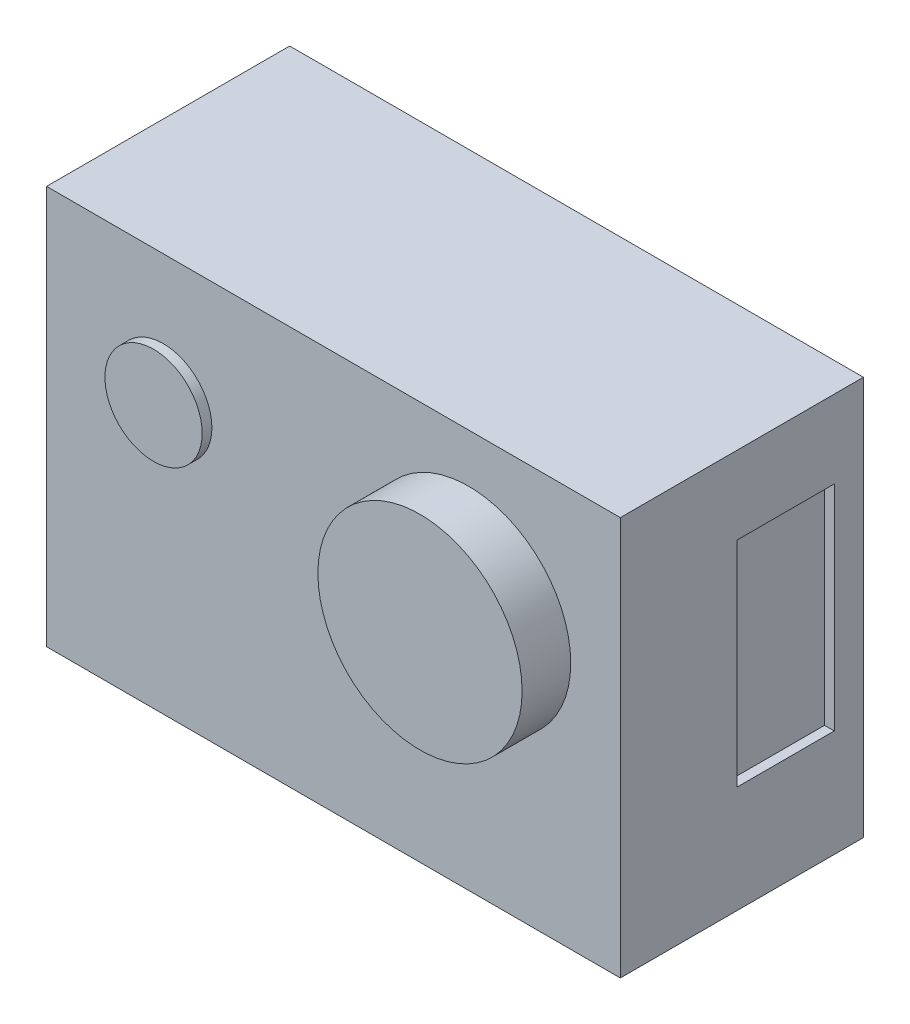
ISO-10303-21;
HEADER;
FILE_DESCRIPTION(('STEP AP214'),'2;1');
FILE_NAME('part.step','',(''),(''),'','','');
FILE_SCHEMA(('AUTOMOTIVE_DESIGN { 1 0 10303 214 1 1 1 1 }'));
ENDSEC;
DATA;
#1=APPLICATION_CONTEXT('core data for automotive mechanical design processes');
#2=APPLICATION_PROTOCOL_DEFINITION('international standard','automotive_design',2000,#1);
#3=PRODUCT_CONTEXT('',#1,'mechanical');
#4=PRODUCT('Part','Part','',(#3));
#5=PRODUCT_RELATED_PRODUCT_CATEGORY('part','',(#4));
#6=PRODUCT_DEFINITION_FORMATION('','',#4);
#7=PRODUCT_DEFINITION_CONTEXT('part definition',#1,'design');
#8=PRODUCT_DEFINITION('design','',#6,#7);
#9=PRODUCT_DEFINITION_SHAPE('','',#8);
#10=(LENGTH_UNIT() NAMED_UNIT(*) SI_UNIT(.MILLI.,.METRE.));
#11=(NAMED_UNIT(*) PLANE_ANGLE_UNIT() SI_UNIT($,.RADIAN.));
#12=(NAMED_UNIT(*) SI_UNIT($,.STERADIAN.) SOLID_ANGLE_UNIT());
#13=UNCERTAINTY_MEASURE_WITH_UNIT(LENGTH_MEASURE(1.E-05),#10,'distance_accuracy_value','');
#14=(GEOMETRIC_REPRESENTATION_CONTEXT(3) GLOBAL_UNCERTAINTY_ASSIGNED_CONTEXT((#13)) GLOBAL_UNIT_ASSIGNED_CONTEXT((#10,
#11,#12)) REPRESENTATION_CONTEXT('',''));
#15=CARTESIAN_POINT('',(0.,0.,0.));
#16=DIRECTION('',(0.,0.,1.));
#17=DIRECTION('',(1.,0.,0.));
#18=AXIS2_PLACEMENT_3D('',#15,#16,#17);
#19=CARTESIAN_POINT('',(-29.5,20.4999999999999,25.));
#20=DIRECTION('',(1.,0.,0.));
#21=DIRECTION('',(0.,1.,0.));
#22=AXIS2_PLACEMENT_3D('',#19,#20,#21);
#23=PLANE('',#22);
#24=DIRECTION('',(0.,-1.,0.));
#25=VECTOR('',#24,1.);
#26=CARTESIAN_POINT('',(-29.5,20.4999999999999,0.));
#27=LINE('',#26,#25);
#28=CARTESIAN_POINT('',(-29.5,20.4999999999999,0.));
#29=VERTEX_POINT('',#28);
#30=CARTESIAN_POINT('',(-29.5,-20.5,0.));
#31=VERTEX_POINT('',#30);
#32=EDGE_CURVE('E164',#29,#31,#27,.T.);
#33=ORIENTED_EDGE('',*,*,#32,.T.);
#34=DIRECTION('',(0.,0.,-1.));
#35=VECTOR('',#34,1.);
#36=CARTESIAN_POINT('',(-29.5,-20.5,25.));
#37=LINE('',#36,#35);
#38=CARTESIAN_POINT('',(-29.5,-20.5,25.));
#39=VERTEX_POINT('',#38);
#40=EDGE_CURVE('E48',#39,#31,#37,.T.);
#41=ORIENTED_EDGE('',*,*,#40,.F.);
#42=DIRECTION('',(0.,-1.,0.));
#43=VECTOR('',#42,1.);
#44=CARTESIAN_POINT('',(-29.5,20.4999999999999,25.));
#45=LINE('',#44,#43);
#46=CARTESIAN_POINT('',(-29.5,20.4999999999999,25.));
#47=VERTEX_POINT('',#46);
#48=EDGE_CURVE('E166',#47,#39,#45,.T.);
#49=ORIENTED_EDGE('',*,*,#48,.F.);
#50=DIRECTION('',(0.,0.,-1.));
#51=VECTOR('',#50,1.);
#52=CARTESIAN_POINT('',(-29.5,20.4999999999999,25.));
#53=LINE('',#52,#51);
#54=EDGE_CURVE('E69',#47,#29,#53,.T.);
#55=ORIENTED_EDGE('',*,*,#54,.T.);
#56=EDGE_LOOP('',(#33,#41,#49,#55));
#57=FACE_BOUND('',#56,.T.);
#58=ADVANCED_FACE('F45',(#57),#23,.F.);
#59=CARTESIAN_POINT('',(-29.5,-20.5,25.));
#60=DIRECTION('',(0.,1.,0.));
#61=DIRECTION('',(0.,0.,1.));
#62=AXIS2_PLACEMENT_3D('',#59,#60,#61);
#63=PLANE('',#62);
#64=DIRECTION('',(1.,0.,0.));
#65=VECTOR('',#64,1.);
#66=CARTESIAN_POINT('',(-29.5,-20.5,0.));
#67=LINE('',#66,#65);
#68=CARTESIAN_POINT('',(29.5,-20.5,0.));
#69=VERTEX_POINT('',#68);
#70=EDGE_CURVE('E176',#31,#69,#67,.T.);
#71=ORIENTED_EDGE('',*,*,#70,.T.);
#72=DIRECTION('',(0.,0.,-1.));
#73=VECTOR('',#72,1.);
#74=CARTESIAN_POINT('',(29.5,-20.5,25.));
#75=LINE('',#74,#73);
#76=CARTESIAN_POINT('',(29.5,-20.5,25.));
#77=VERTEX_POINT('',#76);
#78=EDGE_CURVE('E186',#77,#69,#75,.T.);
#79=ORIENTED_EDGE('',*,*,#78,.F.);
#80=DIRECTION('',(1.,0.,0.));
#81=VECTOR('',#80,1.);
#82=CARTESIAN_POINT('',(-29.5,-20.5,25.));
#83=LINE('',#82,#81);
#84=EDGE_CURVE('E96',#39,#77,#83,.T.);
#85=ORIENTED_EDGE('',*,*,#84,.F.);
#86=ORIENTED_EDGE('',*,*,#40,.T.);
#87=EDGE_LOOP('',(#71,#79,#85,#86));
#88=FACE_BOUND('',#87,.T.);
#89=ADVANCED_FACE('F190',(#88),#63,.F.);
#90=CARTESIAN_POINT('',(29.5,20.4999999999999,25.));
#91=DIRECTION('',(1.,0.,0.));
#92=DIRECTION('',(0.,1.,0.));
#93=AXIS2_PLACEMENT_3D('',#90,#91,#92);
#94=PLANE('',#93);
#95=DIRECTION('',(0.,-1.,0.));
#96=VECTOR('',#95,1.);
#97=CARTESIAN_POINT('',(29.5,12.4999999999999,13.));
#98=LINE('',#97,#96);
#99=CARTESIAN_POINT('',(29.5,12.4999999999999,13.));
#100=VERTEX_POINT('',#99);
#101=CARTESIAN_POINT('',(29.5,-9.50000000000005,13.));
#102=VERTEX_POINT('',#101);
#103=EDGE_CURVE('E60',#100,#102,#98,.T.);
#104=ORIENTED_EDGE('',*,*,#103,.F.);
#105=DIRECTION('',(0.,0.,-1.));
#106=VECTOR('',#105,1.);
#107=CARTESIAN_POINT('',(29.5,12.4999999999999,13.));
#108=LINE('',#107,#106);
#109=CARTESIAN_POINT('',(29.5,12.4999999999999,3.));
#110=VERTEX_POINT('',#109);
#111=EDGE_CURVE('E138',#100,#110,#108,.T.);
#112=ORIENTED_EDGE('',*,*,#111,.T.);
#113=DIRECTION('',(0.,-1.,0.));
#114=VECTOR('',#113,1.);
#115=CARTESIAN_POINT('',(29.5,12.4999999999999,3.));
#116=LINE('',#115,#114);
#117=CARTESIAN_POINT('',(29.5,-9.50000000000005,3.));
#118=VERTEX_POINT('',#117);
#119=EDGE_CURVE('E141',#110,#118,#116,.T.);
#120=ORIENTED_EDGE('',*,*,#119,.T.);
#121=DIRECTION('',(0.,0.,-1.));
#122=VECTOR('',#121,1.);
#123=CARTESIAN_POINT('',(29.5,-9.50000000000005,13.));
#124=LINE('',#123,#122);
#125=EDGE_CURVE('E147',#102,#118,#124,.T.);
#126=ORIENTED_EDGE('',*,*,#125,.F.);
#127=EDGE_LOOP('',(#104,#112,#120,#126));
#128=FACE_BOUND('',#127,.T.);
#129=DIRECTION('',(0.,-1.,0.));
#130=VECTOR('',#129,1.);
#131=CARTESIAN_POINT('',(29.5,20.4999999999999,0.));
#132=LINE('',#131,#130);
#133=CARTESIAN_POINT('',(29.5,20.4999999999999,0.));
#134=VERTEX_POINT('',#133);
#135=EDGE_CURVE('E179',#134,#69,#132,.T.);
#136=ORIENTED_EDGE('',*,*,#135,.F.);
#137=DIRECTION('',(0.,0.,-1.));
#138=VECTOR('',#137,1.);
#139=CARTESIAN_POINT('',(29.5,20.4999999999999,25.));
#140=LINE('',#139,#138);
#141=CARTESIAN_POINT('',(29.5,20.4999999999999,25.));
#142=VERTEX_POINT('',#141);
#143=EDGE_CURVE('E185',#142,#134,#140,.T.);
#144=ORIENTED_EDGE('',*,*,#143,.F.);
#145=DIRECTION('',(0.,-1.,0.));
#146=VECTOR('',#145,1.);
#147=CARTESIAN_POINT('',(29.5,20.4999999999999,25.));
#148=LINE('',#147,#146);
#149=EDGE_CURVE('E170',#142,#77,#148,.T.);
#150=ORIENTED_EDGE('',*,*,#149,.T.);
#151=ORIENTED_EDGE('',*,*,#78,.T.);
#152=EDGE_LOOP('',(#136,#144,#150,#151));
#153=FACE_BOUND('',#152,.T.);
#154=ADVANCED_FACE('F196',(#128,#153),#94,.T.);
#155=CARTESIAN_POINT('',(-29.5,20.4999999999999,25.));
#156=DIRECTION('',(0.,1.,0.));
#157=DIRECTION('',(0.,0.,1.));
#158=AXIS2_PLACEMENT_3D('',#155,#156,#157);
#159=PLANE('',#158);
#160=DIRECTION('',(1.,0.,0.));
#161=VECTOR('',#160,1.);
#162=CARTESIAN_POINT('',(-29.5,20.4999999999999,0.));
#163=LINE('',#162,#161);
#164=EDGE_CURVE('E168',#29,#134,#163,.T.);
#165=ORIENTED_EDGE('',*,*,#164,.F.);
#166=ORIENTED_EDGE('',*,*,#54,.F.);
#167=DIRECTION('',(1.,0.,0.));
#168=VECTOR('',#167,1.);
#169=CARTESIAN_POINT('',(-29.5,20.4999999999999,25.));
#170=LINE('',#169,#168);
#171=EDGE_CURVE('E173',#47,#142,#170,.T.);
#172=ORIENTED_EDGE('',*,*,#171,.T.);
#173=ORIENTED_EDGE('',*,*,#143,.T.);
#174=EDGE_LOOP('',(#165,#166,#172,#173));
#175=FACE_BOUND('',#174,.T.);
#176=ADVANCED_FACE('F193',(#175),#159,.T.);
#177=CARTESIAN_POINT('',(0.,0.,25.));
#178=DIRECTION('',(0.,0.,1.));
#179=DIRECTION('',(1.,0.,0.));
#180=AXIS2_PLACEMENT_3D('',#177,#178,#179);
#181=PLANE('',#180);
#182=CARTESIAN_POINT('',(-17.5,7.49999999999992,25.));
#183=DIRECTION('',(0.,0.,1.));
#184=DIRECTION('',(1.,0.,0.));
#185=AXIS2_PLACEMENT_3D('',#182,#183,#184);
#186=CIRCLE('',#185,4.99999999999999);
#187=CARTESIAN_POINT('',(-12.5,7.49999999999992,25.));
#188=VERTEX_POINT('',#187);
#189=EDGE_CURVE('E153',#188,#188,#186,.T.);
#190=ORIENTED_EDGE('',*,*,#189,.F.);
#191=EDGE_LOOP('',(#190));
#192=FACE_BOUND('',#191,.T.);
#193=CARTESIAN_POINT('',(13.9,4.99999999999995,25.));
#194=DIRECTION('',(0.,0.,1.));
#195=DIRECTION('',(1.,0.,0.));
#196=AXIS2_PLACEMENT_3D('',#193,#194,#195);
#197=CIRCLE('',#196,10.5);
#198=CARTESIAN_POINT('',(24.4,4.99999999999995,25.));
#199=VERTEX_POINT('',#198);
#200=EDGE_CURVE('E11',#199,#199,#197,.T.);
#201=ORIENTED_EDGE('',*,*,#200,.F.);
#202=EDGE_LOOP('',(#201));
#203=FACE_BOUND('',#202,.T.);
#204=ORIENTED_EDGE('',*,*,#48,.T.);
#205=ORIENTED_EDGE('',*,*,#84,.T.);
#206=ORIENTED_EDGE('',*,*,#149,.F.);
#207=ORIENTED_EDGE('',*,*,#171,.F.);
#208=EDGE_LOOP('',(#204,#205,#206,#207));
#209=FACE_BOUND('',#208,.T.);
#210=ADVANCED_FACE('F204',(#192,#203,#209),#181,.T.);
#211=CARTESIAN_POINT('',(0.,0.,0.));
#212=DIRECTION('',(0.,0.,1.));
#213=DIRECTION('',(1.,0.,0.));
#214=AXIS2_PLACEMENT_3D('',#211,#212,#213);
#215=PLANE('',#214);
#216=ORIENTED_EDGE('',*,*,#32,.F.);
#217=ORIENTED_EDGE('',*,*,#164,.T.);
#218=ORIENTED_EDGE('',*,*,#135,.T.);
#219=ORIENTED_EDGE('',*,*,#70,.F.);
#220=EDGE_LOOP('',(#216,#217,#218,#219));
#221=FACE_BOUND('',#220,.T.);
#222=ADVANCED_FACE('F192',(#221),#215,.F.);
#223=CARTESIAN_POINT('',(13.9,4.99999999999995,30.));
#224=DIRECTION('',(0.,0.,-1.));
#225=DIRECTION('',(-1.,0.,0.));
#226=AXIS2_PLACEMENT_3D('',#223,#224,#225);
#227=CYLINDRICAL_SURFACE('',#226,10.5);
#228=CARTESIAN_POINT('',(13.9,4.99999999999995,30.));
#229=DIRECTION('',(0.,0.,1.));
#230=DIRECTION('',(1.,0.,0.));
#231=AXIS2_PLACEMENT_3D('',#228,#229,#230);
#232=CIRCLE('',#231,10.5);
#233=CARTESIAN_POINT('',(24.4,4.99999999999995,30.));
#234=VERTEX_POINT('',#233);
#235=EDGE_CURVE('E160',#234,#234,#232,.T.);
#236=ORIENTED_EDGE('',*,*,#235,.F.);
#237=EDGE_LOOP('',(#236));
#238=FACE_BOUND('',#237,.T.);
#239=ORIENTED_EDGE('',*,*,#200,.T.);
#240=EDGE_LOOP('',(#239));
#241=FACE_BOUND('',#240,.T.);
#242=ADVANCED_FACE('F233',(#238,#241),#227,.T.);
#243=CARTESIAN_POINT('',(0.,0.,30.));
#244=DIRECTION('',(0.,0.,1.));
#245=DIRECTION('',(1.,0.,0.));
#246=AXIS2_PLACEMENT_3D('',#243,#244,#245);
#247=PLANE('',#246);
#248=ORIENTED_EDGE('',*,*,#235,.T.);
#249=EDGE_LOOP('',(#248));
#250=FACE_BOUND('',#249,.T.);
#251=ADVANCED_FACE('F243',(#250),#247,.T.);
#252=CARTESIAN_POINT('',(-17.5,7.49999999999992,26.));
#253=DIRECTION('',(0.,0.,-1.));
#254=DIRECTION('',(-1.,0.,0.));
#255=AXIS2_PLACEMENT_3D('',#252,#253,#254);
#256=CYLINDRICAL_SURFACE('',#255,4.99999999999999);
#257=CARTESIAN_POINT('',(-17.5,7.49999999999992,26.));
#258=DIRECTION('',(0.,0.,1.));
#259=DIRECTION('',(1.,0.,0.));
#260=AXIS2_PLACEMENT_3D('',#257,#258,#259);
#261=CIRCLE('',#260,4.99999999999999);
#262=CARTESIAN_POINT('',(-12.5,7.49999999999992,26.));
#263=VERTEX_POINT('',#262);
#264=EDGE_CURVE('E157',#263,#263,#261,.T.);
#265=ORIENTED_EDGE('',*,*,#264,.F.);
#266=EDGE_LOOP('',(#265));
#267=FACE_BOUND('',#266,.T.);
#268=ORIENTED_EDGE('',*,*,#189,.T.);
#269=EDGE_LOOP('',(#268));
#270=FACE_BOUND('',#269,.T.);
#271=ADVANCED_FACE('F254',(#267,#270),#256,.T.);
#272=CARTESIAN_POINT('',(-17.5,7.49999999999992,26.));
#273=DIRECTION('',(0.,0.,1.));
#274=DIRECTION('',(1.,0.,0.));
#275=AXIS2_PLACEMENT_3D('',#272,#273,#274);
#276=PLANE('',#275);
#277=ORIENTED_EDGE('',*,*,#264,.T.);
#278=EDGE_LOOP('',(#277));
#279=FACE_BOUND('',#278,.T.);
#280=ADVANCED_FACE('F273',(#279),#276,.T.);
#281=CARTESIAN_POINT('',(28.5,12.4999999999999,13.));
#282=DIRECTION('',(0.,0.,1.));
#283=DIRECTION('',(0.,-1.,0.));
#284=AXIS2_PLACEMENT_3D('',#281,#282,#283);
#285=PLANE('',#284);
#286=ORIENTED_EDGE('',*,*,#103,.T.);
#287=DIRECTION('',(1.,0.,0.));
#288=VECTOR('',#287,1.);
#289=CARTESIAN_POINT('',(28.5,-9.50000000000005,13.));
#290=LINE('',#289,#288);
#291=CARTESIAN_POINT('',(28.5,-9.50000000000005,13.));
#292=VERTEX_POINT('',#291);
#293=EDGE_CURVE('E117',#292,#102,#290,.T.);
#294=ORIENTED_EDGE('',*,*,#293,.F.);
#295=DIRECTION('',(0.,-1.,0.));
#296=VECTOR('',#295,1.);
#297=CARTESIAN_POINT('',(28.5,12.4999999999999,13.));
#298=LINE('',#297,#296);
#299=CARTESIAN_POINT('',(28.5,12.4999999999999,13.));
#300=VERTEX_POINT('',#299);
#301=EDGE_CURVE('E121',#300,#292,#298,.T.);
#302=ORIENTED_EDGE('',*,*,#301,.F.);
#303=DIRECTION('',(1.,0.,0.));
#304=VECTOR('',#303,1.);
#305=CARTESIAN_POINT('',(28.5,12.4999999999999,13.));
#306=LINE('',#305,#304);
#307=EDGE_CURVE('E151',#300,#100,#306,.T.);
#308=ORIENTED_EDGE('',*,*,#307,.T.);
#309=EDGE_LOOP('',(#286,#294,#302,#308));
#310=FACE_BOUND('',#309,.T.);
#311=ADVANCED_FACE('F119',(#310),#285,.F.);
#312=CARTESIAN_POINT('',(28.5,12.4999999999999,13.));
#313=DIRECTION('',(0.,-1.,0.));
#314=DIRECTION('',(1.,0.,0.));
#315=AXIS2_PLACEMENT_3D('',#312,#313,#314);
#316=PLANE('',#315);
#317=ORIENTED_EDGE('',*,*,#111,.F.);
#318=ORIENTED_EDGE('',*,*,#307,.F.);
#319=DIRECTION('',(0.,0.,-1.));
#320=VECTOR('',#319,1.);
#321=CARTESIAN_POINT('',(28.5,12.4999999999999,13.));
#322=LINE('',#321,#320);
#323=CARTESIAN_POINT('',(28.5,12.4999999999999,3.));
#324=VERTEX_POINT('',#323);
#325=EDGE_CURVE('E126',#300,#324,#322,.T.);
#326=ORIENTED_EDGE('',*,*,#325,.T.);
#327=DIRECTION('',(1.,0.,0.));
#328=VECTOR('',#327,1.);
#329=CARTESIAN_POINT('',(28.5,12.4999999999999,3.));
#330=LINE('',#329,#328);
#331=EDGE_CURVE('E154',#324,#110,#330,.T.);
#332=ORIENTED_EDGE('',*,*,#331,.T.);
#333=EDGE_LOOP('',(#317,#318,#326,#332));
#334=FACE_BOUND('',#333,.T.);
#335=ADVANCED_FACE('F298',(#334),#316,.T.);
#336=CARTESIAN_POINT('',(28.5,12.4999999999999,3.));
#337=DIRECTION('',(0.,0.,1.));
#338=DIRECTION('',(0.,-1.,0.));
#339=AXIS2_PLACEMENT_3D('',#336,#337,#338);
#340=PLANE('',#339);
#341=ORIENTED_EDGE('',*,*,#119,.F.);
#342=ORIENTED_EDGE('',*,*,#331,.F.);
#343=DIRECTION('',(0.,-1.,0.));
#344=VECTOR('',#343,1.);
#345=CARTESIAN_POINT('',(28.5,12.4999999999999,3.));
#346=LINE('',#345,#344);
#347=CARTESIAN_POINT('',(28.5,-9.50000000000005,3.));
#348=VERTEX_POINT('',#347);
#349=EDGE_CURVE('E134',#324,#348,#346,.T.);
#350=ORIENTED_EDGE('',*,*,#349,.T.);
#351=DIRECTION('',(1.,0.,0.));
#352=VECTOR('',#351,1.);
#353=CARTESIAN_POINT('',(28.5,-9.50000000000005,3.));
#354=LINE('',#353,#352);
#355=EDGE_CURVE('E125',#348,#118,#354,.T.);
#356=ORIENTED_EDGE('',*,*,#355,.T.);
#357=EDGE_LOOP('',(#341,#342,#350,#356));
#358=FACE_BOUND('',#357,.T.);
#359=ADVANCED_FACE('F308',(#358),#340,.T.);
#360=CARTESIAN_POINT('',(28.5,-9.50000000000005,13.));
#361=DIRECTION('',(0.,-1.,0.));
#362=DIRECTION('',(1.,0.,0.));
#363=AXIS2_PLACEMENT_3D('',#360,#361,#362);
#364=PLANE('',#363);
#365=ORIENTED_EDGE('',*,*,#125,.T.);
#366=ORIENTED_EDGE('',*,*,#355,.F.);
#367=DIRECTION('',(0.,0.,-1.));
#368=VECTOR('',#367,1.);
#369=CARTESIAN_POINT('',(28.5,-9.50000000000005,13.));
#370=LINE('',#369,#368);
#371=EDGE_CURVE('E130',#292,#348,#370,.T.);
#372=ORIENTED_EDGE('',*,*,#371,.F.);
#373=ORIENTED_EDGE('',*,*,#293,.T.);
#374=EDGE_LOOP('',(#365,#366,#372,#373));
#375=FACE_BOUND('',#374,.T.);
#376=ADVANCED_FACE('F131',(#375),#364,.F.);
#377=CARTESIAN_POINT('',(28.5,0.,0.));
#378=DIRECTION('',(1.,0.,0.));
#379=DIRECTION('',(0.,0.,-1.));
#380=AXIS2_PLACEMENT_3D('',#377,#378,#379);
#381=PLANE('',#380);
#382=ORIENTED_EDGE('',*,*,#301,.T.);
#383=ORIENTED_EDGE('',*,*,#371,.T.);
#384=ORIENTED_EDGE('',*,*,#349,.F.);
#385=ORIENTED_EDGE('',*,*,#325,.F.);
#386=EDGE_LOOP('',(#382,#383,#384,#385));
#387=FACE_BOUND('',#386,.T.);
#388=ADVANCED_FACE('F137',(#387),#381,.T.);
#389=CLOSED_SHELL('',(#58,#89,#154,#176,#210,#222,#242,#251,#271,#280,#311,#335,#359,#376,#388));
#390=MANIFOLD_SOLID_BREP('B2',#389);
#391=ADVANCED_BREP_SHAPE_REPRESENTATION('',(#18,#390),#14);
#392=SHAPE_DEFINITION_REPRESENTATION(#9,#391);
ENDSEC;
END-ISO-10303-21;
